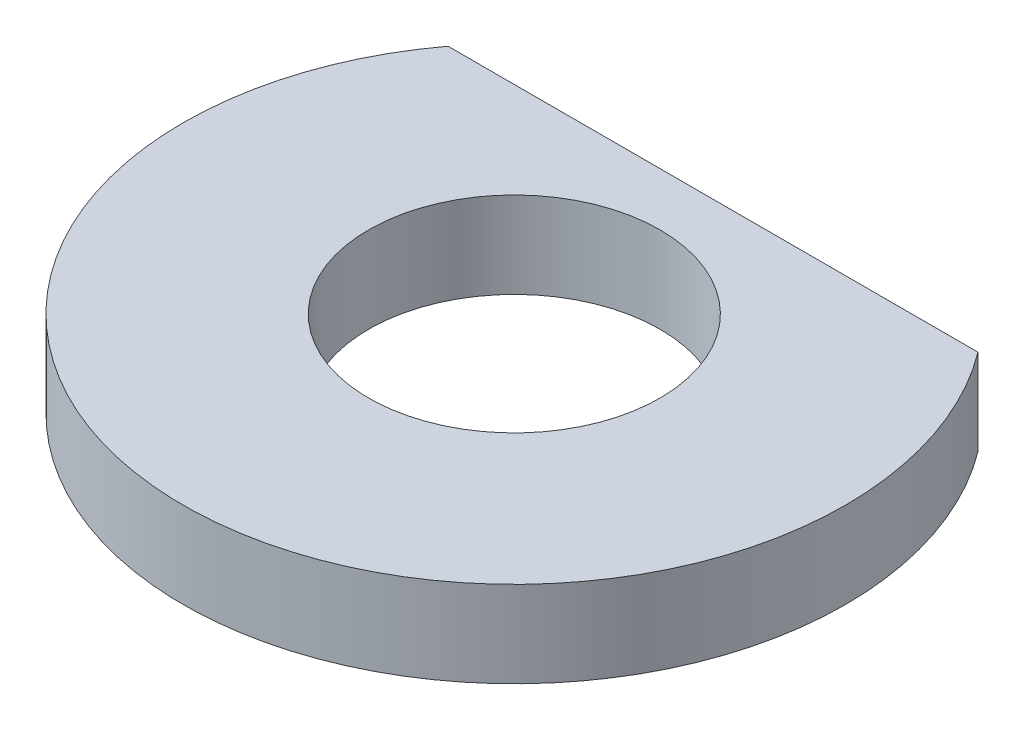
ISO-10303-21;
HEADER;
FILE_DESCRIPTION(('STEP AP214'),'2;1');
FILE_NAME('part.step','',(''),(''),'','','');
FILE_SCHEMA(('AUTOMOTIVE_DESIGN { 1 0 10303 214 1 1 1 1 }'));
ENDSEC;
DATA;
#1=APPLICATION_CONTEXT('core data for automotive mechanical design processes');
#2=APPLICATION_PROTOCOL_DEFINITION('international standard','automotive_design',2000,#1);
#3=PRODUCT_CONTEXT('',#1,'mechanical');
#4=PRODUCT('Part','Part','',(#3));
#5=PRODUCT_RELATED_PRODUCT_CATEGORY('part','',(#4));
#6=PRODUCT_DEFINITION_FORMATION('','',#4);
#7=PRODUCT_DEFINITION_CONTEXT('part definition',#1,'design');
#8=PRODUCT_DEFINITION('design','',#6,#7);
#9=PRODUCT_DEFINITION_SHAPE('','',#8);
#10=(LENGTH_UNIT() NAMED_UNIT(*) SI_UNIT(.MILLI.,.METRE.));
#11=(NAMED_UNIT(*) PLANE_ANGLE_UNIT() SI_UNIT($,.RADIAN.));
#12=(NAMED_UNIT(*) SI_UNIT($,.STERADIAN.) SOLID_ANGLE_UNIT());
#13=UNCERTAINTY_MEASURE_WITH_UNIT(LENGTH_MEASURE(1.E-05),#10,'distance_accuracy_value','');
#14=(GEOMETRIC_REPRESENTATION_CONTEXT(3) GLOBAL_UNCERTAINTY_ASSIGNED_CONTEXT((#13)) GLOBAL_UNIT_ASSIGNED_CONTEXT((#10,
#11,#12)) REPRESENTATION_CONTEXT('',''));
#15=CARTESIAN_POINT('',(0.,0.,0.));
#16=DIRECTION('',(0.,0.,1.));
#17=DIRECTION('',(1.,0.,0.));
#18=AXIS2_PLACEMENT_3D('',#15,#16,#17);
#19=CARTESIAN_POINT('',(0.,1.651,0.));
#20=DIRECTION('',(0.,1.,0.));
#21=DIRECTION('',(0.,0.,1.));
#22=AXIS2_PLACEMENT_3D('',#19,#20,#21);
#23=PLANE('',#22);
#24=CARTESIAN_POINT('',(0.,1.651,0.));
#25=DIRECTION('',(0.,1.,0.));
#26=DIRECTION('',(0.,0.,1.));
#27=AXIS2_PLACEMENT_3D('',#24,#25,#26);
#28=CIRCLE('',#27,2.794);
#29=CARTESIAN_POINT('',(0.,1.651,-2.794));
#30=VERTEX_POINT('',#29);
#31=EDGE_CURVE('E73',#30,#30,#28,.T.);
#32=ORIENTED_EDGE('',*,*,#31,.F.);
#33=EDGE_LOOP('',(#32));
#34=FACE_BOUND('',#33,.T.);
#35=CARTESIAN_POINT('',(0.,1.651,0.));
#36=DIRECTION('',(0.,1.,0.));
#37=DIRECTION('',(0.,0.,1.));
#38=AXIS2_PLACEMENT_3D('',#35,#36,#37);
#39=CIRCLE('',#38,6.35);
#40=CARTESIAN_POINT('',(-5.08,1.651,-3.81));
#41=VERTEX_POINT('',#40);
#42=CARTESIAN_POINT('',(5.08,1.651,-3.81));
#43=VERTEX_POINT('',#42);
#44=EDGE_CURVE('E61',#41,#43,#39,.T.);
#45=ORIENTED_EDGE('',*,*,#44,.T.);
#46=DIRECTION('',(-1.,0.,0.));
#47=VECTOR('',#46,1.);
#48=CARTESIAN_POINT('',(0.,1.651,-3.81));
#49=LINE('',#48,#47);
#50=EDGE_CURVE('E67',#43,#41,#49,.T.);
#51=ORIENTED_EDGE('',*,*,#50,.T.);
#52=EDGE_LOOP('',(#45,#51));
#53=FACE_BOUND('',#52,.T.);
#54=ADVANCED_FACE('F35',(#34,#53),#23,.T.);
#55=CARTESIAN_POINT('',(0.,0.,0.));
#56=DIRECTION('',(0.,1.,0.));
#57=DIRECTION('',(0.,0.,1.));
#58=AXIS2_PLACEMENT_3D('',#55,#56,#57);
#59=PLANE('',#58);
#60=CARTESIAN_POINT('',(0.,0.,0.));
#61=DIRECTION('',(0.,1.,0.));
#62=DIRECTION('',(0.,0.,1.));
#63=AXIS2_PLACEMENT_3D('',#60,#61,#62);
#64=CIRCLE('',#63,2.794);
#65=CARTESIAN_POINT('',(0.,0.,-2.794));
#66=VERTEX_POINT('',#65);
#67=EDGE_CURVE('E69',#66,#66,#64,.T.);
#68=ORIENTED_EDGE('',*,*,#67,.T.);
#69=EDGE_LOOP('',(#68));
#70=FACE_BOUND('',#69,.T.);
#71=DIRECTION('',(-1.,0.,0.));
#72=VECTOR('',#71,1.);
#73=CARTESIAN_POINT('',(0.,0.,-3.81));
#74=LINE('',#73,#72);
#75=CARTESIAN_POINT('',(5.08,0.,-3.81));
#76=VERTEX_POINT('',#75);
#77=CARTESIAN_POINT('',(-5.08,0.,-3.81));
#78=VERTEX_POINT('',#77);
#79=EDGE_CURVE('E55',#76,#78,#74,.T.);
#80=ORIENTED_EDGE('',*,*,#79,.F.);
#81=CARTESIAN_POINT('',(0.,0.,0.));
#82=DIRECTION('',(0.,1.,0.));
#83=DIRECTION('',(0.,0.,1.));
#84=AXIS2_PLACEMENT_3D('',#81,#82,#83);
#85=CIRCLE('',#84,6.35);
#86=EDGE_CURVE('E65',#78,#76,#85,.T.);
#87=ORIENTED_EDGE('',*,*,#86,.F.);
#88=EDGE_LOOP('',(#80,#87));
#89=FACE_BOUND('',#88,.T.);
#90=ADVANCED_FACE('F85',(#70,#89),#59,.F.);
#91=CARTESIAN_POINT('',(0.,1.651,0.));
#92=DIRECTION('',(0.,-1.,0.));
#93=DIRECTION('',(0.,0.,-1.));
#94=AXIS2_PLACEMENT_3D('',#91,#92,#93);
#95=CYLINDRICAL_SURFACE('',#94,6.35);
#96=DIRECTION('',(0.,-1.,0.));
#97=VECTOR('',#96,1.);
#98=CARTESIAN_POINT('',(5.08,1.651,-3.81));
#99=LINE('',#98,#97);
#100=EDGE_CURVE('E11',#43,#76,#99,.T.);
#101=ORIENTED_EDGE('',*,*,#100,.F.);
#102=ORIENTED_EDGE('',*,*,#44,.F.);
#103=DIRECTION('',(0.,-1.,0.));
#104=VECTOR('',#103,1.);
#105=CARTESIAN_POINT('',(-5.08,1.651,-3.81));
#106=LINE('',#105,#104);
#107=EDGE_CURVE('E43',#78,#41,#106,.F.);
#108=ORIENTED_EDGE('',*,*,#107,.F.);
#109=ORIENTED_EDGE('',*,*,#86,.T.);
#110=EDGE_LOOP('',(#101,#102,#108,#109));
#111=FACE_BOUND('',#110,.T.);
#112=ADVANCED_FACE('F37',(#111),#95,.T.);
#113=CARTESIAN_POINT('',(0.,1.651,0.));
#114=DIRECTION('',(0.,-1.,0.));
#115=DIRECTION('',(0.,0.,-1.));
#116=AXIS2_PLACEMENT_3D('',#113,#114,#115);
#117=CYLINDRICAL_SURFACE('',#116,2.794);
#118=CARTESIAN_POINT('',(0.,1.651,-2.794));
#119=CARTESIAN_POINT('',(0.,1.63380208333333,-2.794));
#120=CARTESIAN_POINT('',(0.,1.61660416666667,-2.794));
#121=CARTESIAN_POINT('',(0.,1.58220833333333,-2.794));
#122=CARTESIAN_POINT('',(0.,1.56501041666667,-2.794));
#123=CARTESIAN_POINT('',(0.,1.53061458333333,-2.794));
#124=CARTESIAN_POINT('',(0.,1.51341666666667,-2.794));
#125=CARTESIAN_POINT('',(0.,1.47902083333333,-2.794));
#126=CARTESIAN_POINT('',(0.,1.46182291666667,-2.794));
#127=CARTESIAN_POINT('',(0.,1.42742708333333,-2.794));
#128=CARTESIAN_POINT('',(0.,1.41022916666667,-2.794));
#129=CARTESIAN_POINT('',(0.,1.37583333333333,-2.794));
#130=CARTESIAN_POINT('',(0.,1.35863541666667,-2.794));
#131=CARTESIAN_POINT('',(0.,1.32423958333333,-2.794));
#132=CARTESIAN_POINT('',(0.,1.30704166666667,-2.794));
#133=CARTESIAN_POINT('',(0.,1.27264583333333,-2.794));
#134=CARTESIAN_POINT('',(0.,1.25544791666667,-2.794));
#135=CARTESIAN_POINT('',(0.,1.22105208333333,-2.794));
#136=CARTESIAN_POINT('',(0.,1.20385416666667,-2.794));
#137=CARTESIAN_POINT('',(0.,1.16945833333333,-2.794));
#138=CARTESIAN_POINT('',(0.,1.15226041666667,-2.794));
#139=CARTESIAN_POINT('',(0.,1.11786458333333,-2.794));
#140=CARTESIAN_POINT('',(0.,1.10066666666667,-2.794));
#141=CARTESIAN_POINT('',(0.,1.06627083333333,-2.794));
#142=CARTESIAN_POINT('',(0.,1.04907291666667,-2.794));
#143=CARTESIAN_POINT('',(0.,1.01467708333333,-2.794));
#144=CARTESIAN_POINT('',(0.,0.997479166666666,-2.794));
#145=CARTESIAN_POINT('',(0.,0.963083333333333,-2.794));
#146=CARTESIAN_POINT('',(0.,0.945885416666666,-2.794));
#147=CARTESIAN_POINT('',(0.,0.911489583333333,-2.794));
#148=CARTESIAN_POINT('',(0.,0.894291666666666,-2.794));
#149=CARTESIAN_POINT('',(0.,0.859895833333333,-2.794));
#150=CARTESIAN_POINT('',(0.,0.842697916666666,-2.794));
#151=CARTESIAN_POINT('',(0.,0.808302083333333,-2.794));
#152=CARTESIAN_POINT('',(0.,0.791104166666666,-2.794));
#153=CARTESIAN_POINT('',(0.,0.756708333333333,-2.794));
#154=CARTESIAN_POINT('',(0.,0.739510416666667,-2.794));
#155=CARTESIAN_POINT('',(0.,0.705114583333333,-2.794));
#156=CARTESIAN_POINT('',(0.,0.687916666666667,-2.794));
#157=CARTESIAN_POINT('',(0.,0.653520833333333,-2.794));
#158=CARTESIAN_POINT('',(0.,0.636322916666667,-2.794));
#159=CARTESIAN_POINT('',(0.,0.601927083333333,-2.794));
#160=CARTESIAN_POINT('',(0.,0.584729166666667,-2.794));
#161=CARTESIAN_POINT('',(0.,0.550333333333333,-2.794));
#162=CARTESIAN_POINT('',(0.,0.533135416666667,-2.794));
#163=CARTESIAN_POINT('',(0.,0.498739583333333,-2.794));
#164=CARTESIAN_POINT('',(0.,0.481541666666667,-2.794));
#165=CARTESIAN_POINT('',(0.,0.447145833333333,-2.794));
#166=CARTESIAN_POINT('',(0.,0.429947916666667,-2.794));
#167=CARTESIAN_POINT('',(0.,0.395552083333333,-2.794));
#168=CARTESIAN_POINT('',(0.,0.378354166666667,-2.794));
#169=CARTESIAN_POINT('',(0.,0.343958333333333,-2.794));
#170=CARTESIAN_POINT('',(0.,0.326760416666667,-2.794));
#171=CARTESIAN_POINT('',(0.,0.292364583333333,-2.794));
#172=CARTESIAN_POINT('',(0.,0.275166666666667,-2.794));
#173=CARTESIAN_POINT('',(0.,0.240770833333333,-2.794));
#174=CARTESIAN_POINT('',(0.,0.223572916666667,-2.794));
#175=CARTESIAN_POINT('',(0.,0.189177083333333,-2.794));
#176=CARTESIAN_POINT('',(0.,0.171979166666667,-2.794));
#177=CARTESIAN_POINT('',(0.,0.137583333333333,-2.794));
#178=CARTESIAN_POINT('',(0.,0.120385416666667,-2.794));
#179=CARTESIAN_POINT('',(0.,0.0859895833333333,-2.794));
#180=CARTESIAN_POINT('',(0.,0.0687916666666667,-2.794));
#181=CARTESIAN_POINT('',(0.,0.0343958333333333,-2.794));
#182=CARTESIAN_POINT('',(0.,0.0171979166666666,-2.794));
#183=CARTESIAN_POINT('',(0.,0.,-2.794));
#184=B_SPLINE_CURVE_WITH_KNOTS('',3,(#118,#119,#120,#121,#122,#123,#124,#125,#126,#127,#128,
#129,#130,#131,#132,#133,#134,#135,#136,#137,#138,#139,#140,#141,#142,#143,#144,#145,#146,#147,
#148,#149,#150,#151,#152,#153,#154,#155,#156,#157,#158,#159,#160,#161,#162,#163,#164,#165,#166,
#167,#168,#169,#170,#171,#172,#173,#174,#175,#176,#177,#178,#179,#180,#181,#182,#183),
.UNSPECIFIED.,.F.,.F.,(4,2,2,2,2,2,2,2,2,2,2,2,2,2,2,2,2,2,2,2,2,2,2,2,2,2,2,2,2,2,2,2,4),(0.,
0.0515937500000002,0.1031875,0.15478125,0.206375,0.25796875,0.3095625,0.36115625,0.41275,
0.46434375,0.5159375,0.56753125,0.619125,0.67071875,0.7223125,0.77390625,0.8255,0.87709375,
0.9286875,0.98028125,1.031875,1.08346875,1.1350625,1.18665625,1.23825,1.28984375,1.3414375,
1.39303125,1.444625,1.49621875,1.5478125,1.59940625,1.651),.UNSPECIFIED.);
#185=EDGE_CURVE('BSEAM81',#30,#66,#184,.T.);
#186=ORIENTED_EDGE('',*,*,#31,.T.);
#187=ORIENTED_EDGE('',*,*,#67,.F.);
#188=ORIENTED_EDGE('',*,*,#185,.T.);
#189=ORIENTED_EDGE('',*,*,#185,.F.);
#190=EDGE_LOOP('',(#186,#188,#187,#189));
#191=FACE_BOUND('',#190,.T.);
#192=ADVANCED_FACE('F81',(#191),#117,.F.);
#193=CARTESIAN_POINT('',(-5.08,24.1962947211275,-3.81));
#194=DIRECTION('',(0.,0.,-1.));
#195=DIRECTION('',(-1.,0.,0.));
#196=AXIS2_PLACEMENT_3D('',#193,#194,#195);
#197=PLANE('',#196);
#198=ORIENTED_EDGE('',*,*,#50,.F.);
#199=ORIENTED_EDGE('',*,*,#100,.T.);
#200=ORIENTED_EDGE('',*,*,#79,.T.);
#201=ORIENTED_EDGE('',*,*,#107,.T.);
#202=EDGE_LOOP('',(#198,#199,#200,#201));
#203=FACE_BOUND('',#202,.T.);
#204=ADVANCED_FACE('F71',(#203),#197,.T.);
#205=CLOSED_SHELL('',(#54,#90,#112,#192,#204));
#206=MANIFOLD_SOLID_BREP('B2',#205);
#207=ADVANCED_BREP_SHAPE_REPRESENTATION('',(#18,#206),#14);
#208=SHAPE_DEFINITION_REPRESENTATION(#9,#207);
ENDSEC;
END-ISO-10303-21;
